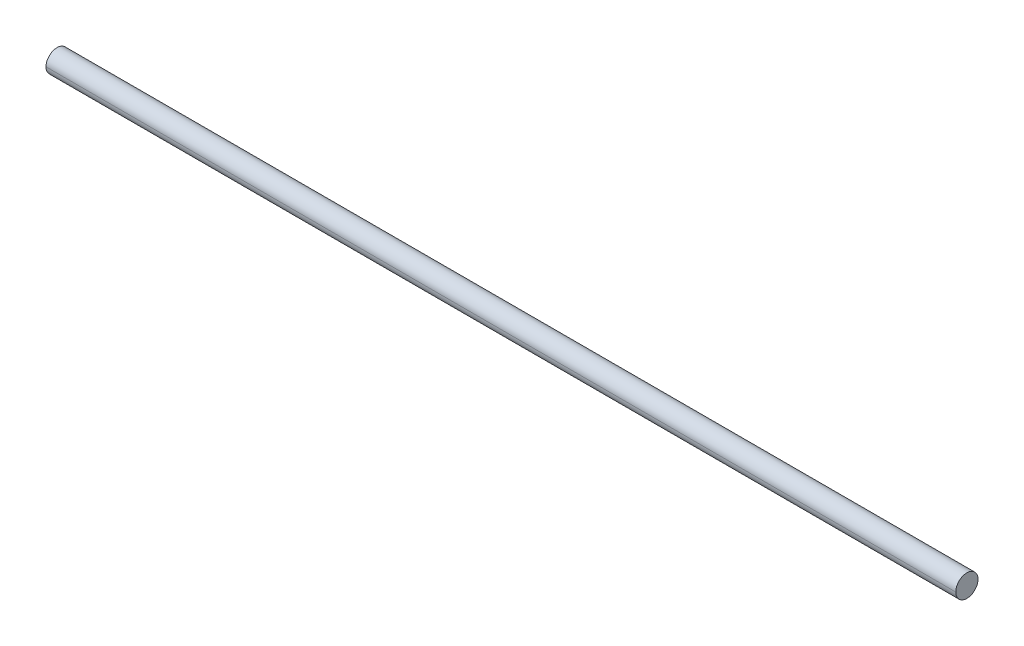
ISO-10303-21;
HEADER;
FILE_DESCRIPTION(('STEP AP214'),'2;1');
FILE_NAME('part.step','',(''),(''),'','','');
FILE_SCHEMA(('AUTOMOTIVE_DESIGN { 1 0 10303 214 1 1 1 1 }'));
ENDSEC;
DATA;
#1=APPLICATION_CONTEXT('core data for automotive mechanical design processes');
#2=APPLICATION_PROTOCOL_DEFINITION('international standard','automotive_design',2000,#1);
#3=PRODUCT_CONTEXT('',#1,'mechanical');
#4=PRODUCT('Part','Part','',(#3));
#5=PRODUCT_RELATED_PRODUCT_CATEGORY('part','',(#4));
#6=PRODUCT_DEFINITION_FORMATION('','',#4);
#7=PRODUCT_DEFINITION_CONTEXT('part definition',#1,'design');
#8=PRODUCT_DEFINITION('design','',#6,#7);
#9=PRODUCT_DEFINITION_SHAPE('','',#8);
#10=(LENGTH_UNIT() NAMED_UNIT(*) SI_UNIT(.MILLI.,.METRE.));
#11=(NAMED_UNIT(*) PLANE_ANGLE_UNIT() SI_UNIT($,.RADIAN.));
#12=(NAMED_UNIT(*) SI_UNIT($,.STERADIAN.) SOLID_ANGLE_UNIT());
#13=UNCERTAINTY_MEASURE_WITH_UNIT(LENGTH_MEASURE(1.E-05),#10,'distance_accuracy_value','');
#14=(GEOMETRIC_REPRESENTATION_CONTEXT(3) GLOBAL_UNCERTAINTY_ASSIGNED_CONTEXT((#13)) GLOBAL_UNIT_ASSIGNED_CONTEXT((#10,
#11,#12)) REPRESENTATION_CONTEXT('',''));
#15=CARTESIAN_POINT('',(0.,0.,0.));
#16=DIRECTION('',(0.,0.,1.));
#17=DIRECTION('',(1.,0.,0.));
#18=AXIS2_PLACEMENT_3D('',#15,#16,#17);
#19=CARTESIAN_POINT('',(-8.99999999999999,0.,0.));
#20=DIRECTION('',(1.,0.,0.));
#21=DIRECTION('',(0.,0.,-1.));
#22=AXIS2_PLACEMENT_3D('',#19,#20,#21);
#23=PLANE('',#22);
#24=CARTESIAN_POINT('',(-8.99999999999999,0.,0.));
#25=DIRECTION('',(1.,0.,0.));
#26=DIRECTION('',(0.,0.,-1.));
#27=AXIS2_PLACEMENT_3D('',#24,#25,#26);
#28=CIRCLE('',#27,0.4826);
#29=CARTESIAN_POINT('',(-8.99999999999999,0.,-0.4826));
#30=VERTEX_POINT('',#29);
#31=CARTESIAN_POINT('',(-8.99999999999999,0.,0.4826));
#32=VERTEX_POINT('',#31);
#33=EDGE_CURVE('E11',#30,#32,#28,.T.);
#34=ORIENTED_EDGE('',*,*,#33,.F.);
#35=CARTESIAN_POINT('',(-8.99999999999999,0.,0.));
#36=DIRECTION('',(1.,0.,0.));
#37=DIRECTION('',(0.,0.,-1.));
#38=AXIS2_PLACEMENT_3D('',#35,#36,#37);
#39=CIRCLE('',#38,0.4826);
#40=EDGE_CURVE('E24',#32,#30,#39,.T.);
#41=ORIENTED_EDGE('',*,*,#40,.F.);
#42=EDGE_LOOP('',(#34,#41));
#43=FACE_BOUND('',#42,.T.);
#44=ADVANCED_FACE('F16',(#43),#23,.F.);
#45=CARTESIAN_POINT('',(30.48,0.,0.));
#46=DIRECTION('',(1.,0.,0.));
#47=DIRECTION('',(0.,1.,0.));
#48=AXIS2_PLACEMENT_3D('',#45,#46,#47);
#49=CYLINDRICAL_SURFACE('',#48,0.4826);
#50=ORIENTED_EDGE('',*,*,#40,.T.);
#51=CARTESIAN_POINT('',(-8.99999999999999,0.,-0.4826));
#52=DIRECTION('',(1.,0.,0.));
#53=VECTOR('',#52,1.);
#54=LINE('',#51,#53);
#55=CARTESIAN_POINT('',(30.48,0.,-0.4826));
#56=VERTEX_POINT('',#55);
#57=EDGE_CURVE('E45',#30,#56,#54,.T.);
#58=ORIENTED_EDGE('',*,*,#57,.T.);
#59=CARTESIAN_POINT('',(30.48,0.,0.));
#60=DIRECTION('',(1.,0.,0.));
#61=DIRECTION('',(0.,0.,-1.));
#62=AXIS2_PLACEMENT_3D('',#59,#60,#61);
#63=CIRCLE('',#62,0.4826);
#64=CARTESIAN_POINT('',(30.48,0.,0.4826));
#65=VERTEX_POINT('',#64);
#66=EDGE_CURVE('E39',#65,#56,#63,.T.);
#67=ORIENTED_EDGE('',*,*,#66,.F.);
#68=CARTESIAN_POINT('',(-8.99999999999999,0.,0.4826));
#69=DIRECTION('',(1.,0.,0.));
#70=VECTOR('',#69,1.);
#71=LINE('',#68,#70);
#72=EDGE_CURVE('E42',#32,#65,#71,.T.);
#73=ORIENTED_EDGE('',*,*,#72,.F.);
#74=EDGE_LOOP('',(#50,#58,#67,#73));
#75=FACE_BOUND('',#74,.T.);
#76=ADVANCED_FACE('F41',(#75),#49,.T.);
#77=CARTESIAN_POINT('',(30.48,0.,0.));
#78=DIRECTION('',(1.,0.,0.));
#79=DIRECTION('',(0.,-1.,0.));
#80=AXIS2_PLACEMENT_3D('',#77,#78,#79);
#81=CYLINDRICAL_SURFACE('',#80,0.4826);
#82=CARTESIAN_POINT('',(30.48,0.,0.));
#83=DIRECTION('',(1.,0.,0.));
#84=DIRECTION('',(0.,0.,-1.));
#85=AXIS2_PLACEMENT_3D('',#82,#83,#84);
#86=CIRCLE('',#85,0.4826);
#87=EDGE_CURVE('E54',#56,#65,#86,.T.);
#88=ORIENTED_EDGE('',*,*,#87,.F.);
#89=ORIENTED_EDGE('',*,*,#57,.F.);
#90=ORIENTED_EDGE('',*,*,#33,.T.);
#91=ORIENTED_EDGE('',*,*,#72,.T.);
#92=EDGE_LOOP('',(#88,#89,#90,#91));
#93=FACE_BOUND('',#92,.T.);
#94=ADVANCED_FACE('F53',(#93),#81,.T.);
#95=CARTESIAN_POINT('',(30.48,0.,0.));
#96=DIRECTION('',(1.,0.,0.));
#97=DIRECTION('',(0.,0.,-1.));
#98=AXIS2_PLACEMENT_3D('',#95,#96,#97);
#99=PLANE('',#98);
#100=ORIENTED_EDGE('',*,*,#87,.T.);
#101=ORIENTED_EDGE('',*,*,#66,.T.);
#102=EDGE_LOOP('',(#100,#101));
#103=FACE_BOUND('',#102,.T.);
#104=ADVANCED_FACE('F57',(#103),#99,.T.);
#105=CLOSED_SHELL('',(#44,#76,#94,#104));
#106=MANIFOLD_SOLID_BREP('B1',#105);
#107=ADVANCED_BREP_SHAPE_REPRESENTATION('',(#18,#106),#14);
#108=SHAPE_DEFINITION_REPRESENTATION(#9,#107);
ENDSEC;
END-ISO-10303-21;
